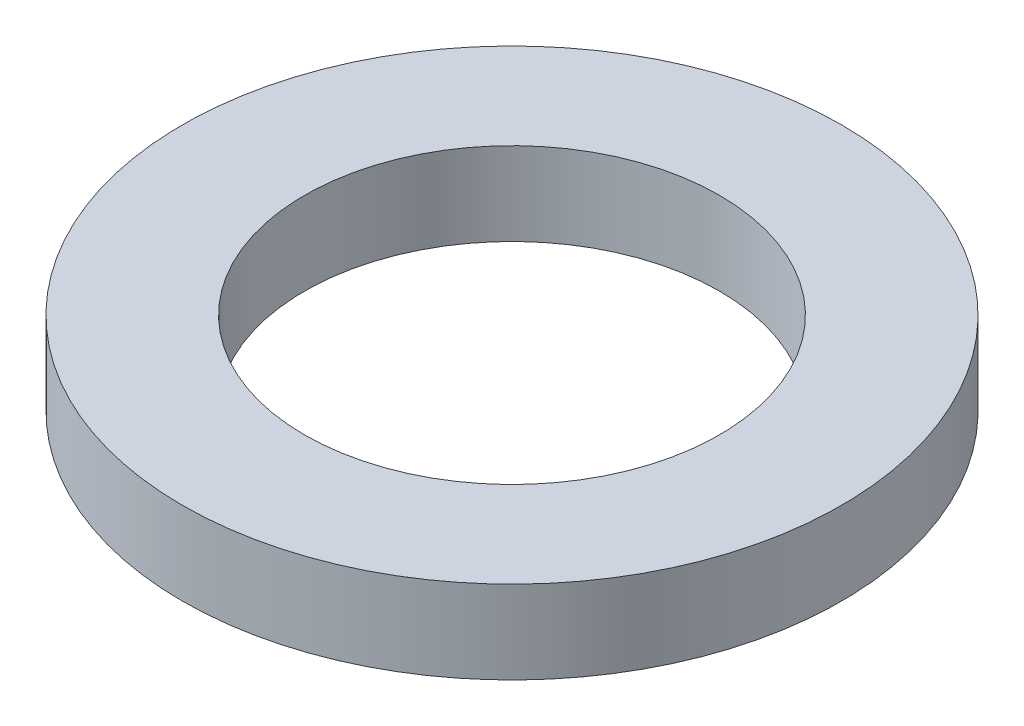
ISO-10303-21;
HEADER;
FILE_DESCRIPTION(('STEP AP214'),'2;1');
FILE_NAME('part.step','',(''),(''),'','','');
FILE_SCHEMA(('AUTOMOTIVE_DESIGN { 1 0 10303 214 1 1 1 1 }'));
ENDSEC;
DATA;
#1=APPLICATION_CONTEXT('core data for automotive mechanical design processes');
#2=APPLICATION_PROTOCOL_DEFINITION('international standard','automotive_design',2000,#1);
#3=PRODUCT_CONTEXT('',#1,'mechanical');
#4=PRODUCT('Part','Part','',(#3));
#5=PRODUCT_RELATED_PRODUCT_CATEGORY('part','',(#4));
#6=PRODUCT_DEFINITION_FORMATION('','',#4);
#7=PRODUCT_DEFINITION_CONTEXT('part definition',#1,'design');
#8=PRODUCT_DEFINITION('design','',#6,#7);
#9=PRODUCT_DEFINITION_SHAPE('','',#8);
#10=(LENGTH_UNIT() NAMED_UNIT(*) SI_UNIT(.MILLI.,.METRE.));
#11=(NAMED_UNIT(*) PLANE_ANGLE_UNIT() SI_UNIT($,.RADIAN.));
#12=(NAMED_UNIT(*) SI_UNIT($,.STERADIAN.) SOLID_ANGLE_UNIT());
#13=UNCERTAINTY_MEASURE_WITH_UNIT(LENGTH_MEASURE(1.E-05),#10,'distance_accuracy_value','');
#14=(GEOMETRIC_REPRESENTATION_CONTEXT(3) GLOBAL_UNCERTAINTY_ASSIGNED_CONTEXT((#13)) GLOBAL_UNIT_ASSIGNED_CONTEXT((#10,
#11,#12)) REPRESENTATION_CONTEXT('',''));
#15=CARTESIAN_POINT('',(0.,0.,0.));
#16=DIRECTION('',(0.,0.,1.));
#17=DIRECTION('',(1.,0.,0.));
#18=AXIS2_PLACEMENT_3D('',#15,#16,#17);
#19=CARTESIAN_POINT('',(0.,-0.85,0.));
#20=DIRECTION('',(0.,1.,0.));
#21=DIRECTION('',(0.,0.,1.));
#22=AXIS2_PLACEMENT_3D('',#19,#20,#21);
#23=PLANE('',#22);
#24=CARTESIAN_POINT('',(0.,-0.85,0.));
#25=DIRECTION('',(0.,1.,0.));
#26=DIRECTION('',(0.,0.,1.));
#27=AXIS2_PLACEMENT_3D('',#24,#25,#26);
#28=CIRCLE('',#27,4.25);
#29=CARTESIAN_POINT('',(0.,-0.85,4.25));
#30=VERTEX_POINT('',#29);
#31=EDGE_CURVE('E28',#30,#30,#28,.T.);
#32=ORIENTED_EDGE('',*,*,#31,.T.);
#33=EDGE_LOOP('',(#32));
#34=FACE_BOUND('',#33,.T.);
#35=CARTESIAN_POINT('',(0.,-0.85,0.));
#36=DIRECTION('',(0.,1.,0.));
#37=DIRECTION('',(0.,0.,1.));
#38=AXIS2_PLACEMENT_3D('',#35,#36,#37);
#39=CIRCLE('',#38,6.75);
#40=CARTESIAN_POINT('',(0.,-0.85,6.75));
#41=VERTEX_POINT('',#40);
#42=EDGE_CURVE('E19',#41,#41,#39,.T.);
#43=ORIENTED_EDGE('',*,*,#42,.F.);
#44=EDGE_LOOP('',(#43));
#45=FACE_BOUND('',#44,.T.);
#46=ADVANCED_FACE('F16',(#34,#45),#23,.F.);
#47=CARTESIAN_POINT('',(0.,0.85,0.));
#48=DIRECTION('',(0.,1.,0.));
#49=DIRECTION('',(0.,0.,1.));
#50=AXIS2_PLACEMENT_3D('',#47,#48,#49);
#51=CYLINDRICAL_SURFACE('',#50,6.75);
#52=CARTESIAN_POINT('',(0.,0.85,0.));
#53=DIRECTION('',(0.,1.,0.));
#54=DIRECTION('',(0.,0.,1.));
#55=AXIS2_PLACEMENT_3D('',#52,#53,#54);
#56=CIRCLE('',#55,6.75);
#57=CARTESIAN_POINT('',(0.,0.85,6.75));
#58=VERTEX_POINT('',#57);
#59=EDGE_CURVE('E23',#58,#58,#56,.T.);
#60=ORIENTED_EDGE('',*,*,#59,.F.);
#61=EDGE_LOOP('',(#60));
#62=FACE_BOUND('',#61,.T.);
#63=ORIENTED_EDGE('',*,*,#42,.T.);
#64=EDGE_LOOP('',(#63));
#65=FACE_BOUND('',#64,.T.);
#66=ADVANCED_FACE('F36',(#62,#65),#51,.T.);
#67=CARTESIAN_POINT('',(0.,0.85,0.));
#68=DIRECTION('',(0.,1.,0.));
#69=DIRECTION('',(0.,0.,1.));
#70=AXIS2_PLACEMENT_3D('',#67,#68,#69);
#71=CYLINDRICAL_SURFACE('',#70,4.25);
#72=CARTESIAN_POINT('',(0.,0.85,0.));
#73=DIRECTION('',(0.,1.,0.));
#74=DIRECTION('',(0.,0.,1.));
#75=AXIS2_PLACEMENT_3D('',#72,#73,#74);
#76=CIRCLE('',#75,4.25);
#77=CARTESIAN_POINT('',(0.,0.85,4.25));
#78=VERTEX_POINT('',#77);
#79=EDGE_CURVE('E10',#78,#78,#76,.F.);
#80=ORIENTED_EDGE('',*,*,#79,.F.);
#81=EDGE_LOOP('',(#80));
#82=FACE_BOUND('',#81,.T.);
#83=ORIENTED_EDGE('',*,*,#31,.F.);
#84=EDGE_LOOP('',(#83));
#85=FACE_BOUND('',#84,.T.);
#86=ADVANCED_FACE('F42',(#82,#85),#71,.F.);
#87=CARTESIAN_POINT('',(0.,0.85,0.));
#88=DIRECTION('',(0.,1.,0.));
#89=DIRECTION('',(0.,0.,1.));
#90=AXIS2_PLACEMENT_3D('',#87,#88,#89);
#91=PLANE('',#90);
#92=ORIENTED_EDGE('',*,*,#79,.T.);
#93=EDGE_LOOP('',(#92));
#94=FACE_BOUND('',#93,.T.);
#95=ORIENTED_EDGE('',*,*,#59,.T.);
#96=EDGE_LOOP('',(#95));
#97=FACE_BOUND('',#96,.T.);
#98=ADVANCED_FACE('F44',(#94,#97),#91,.T.);
#99=CLOSED_SHELL('',(#46,#66,#86,#98));
#100=MANIFOLD_SOLID_BREP('B1',#99);
#101=ADVANCED_BREP_SHAPE_REPRESENTATION('',(#18,#100),#14);
#102=SHAPE_DEFINITION_REPRESENTATION(#9,#101);
ENDSEC;
END-ISO-10303-21;
